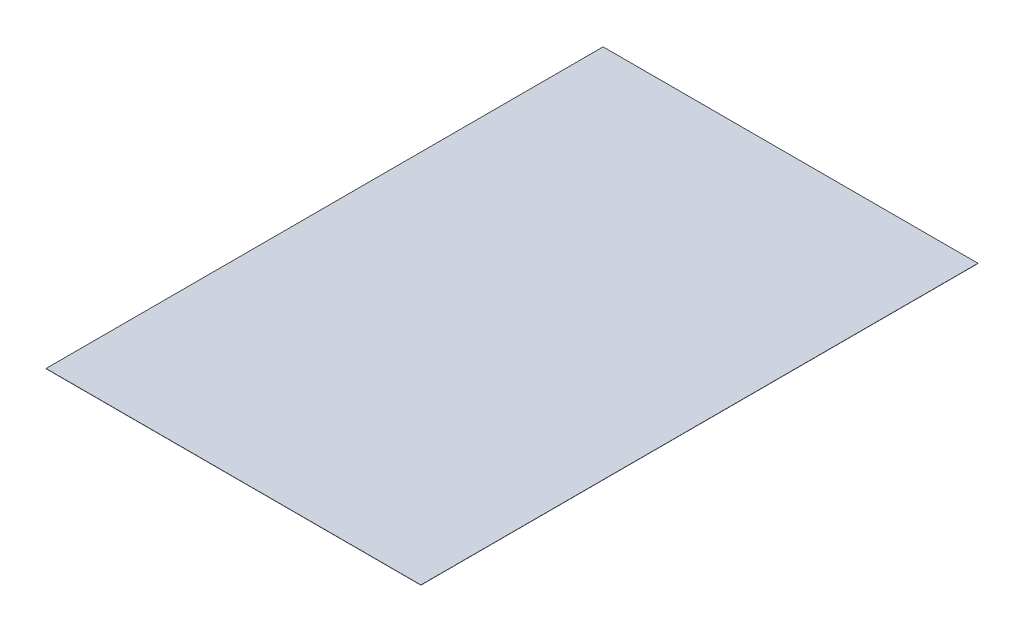
ISO-10303-21;
HEADER;
FILE_DESCRIPTION(('STEP AP214'),'2;1');
FILE_NAME('part.step','',(''),(''),'','','');
FILE_SCHEMA(('AUTOMOTIVE_DESIGN { 1 0 10303 214 1 1 1 1 }'));
ENDSEC;
DATA;
#1=APPLICATION_CONTEXT('core data for automotive mechanical design processes');
#2=APPLICATION_PROTOCOL_DEFINITION('international standard','automotive_design',2000,#1);
#3=PRODUCT_CONTEXT('',#1,'mechanical');
#4=PRODUCT('Part','Part','',(#3));
#5=PRODUCT_RELATED_PRODUCT_CATEGORY('part','',(#4));
#6=PRODUCT_DEFINITION_FORMATION('','',#4);
#7=PRODUCT_DEFINITION_CONTEXT('part definition',#1,'design');
#8=PRODUCT_DEFINITION('design','',#6,#7);
#9=PRODUCT_DEFINITION_SHAPE('','',#8);
#10=(LENGTH_UNIT() NAMED_UNIT(*) SI_UNIT(.MILLI.,.METRE.));
#11=(NAMED_UNIT(*) PLANE_ANGLE_UNIT() SI_UNIT($,.RADIAN.));
#12=(NAMED_UNIT(*) SI_UNIT($,.STERADIAN.) SOLID_ANGLE_UNIT());
#13=UNCERTAINTY_MEASURE_WITH_UNIT(LENGTH_MEASURE(1.E-05),#10,'distance_accuracy_value','');
#14=(GEOMETRIC_REPRESENTATION_CONTEXT(3) GLOBAL_UNCERTAINTY_ASSIGNED_CONTEXT((#13)) GLOBAL_UNIT_ASSIGNED_CONTEXT((#10,
#11,#12)) REPRESENTATION_CONTEXT('',''));
#15=CARTESIAN_POINT('',(0.,0.,0.));
#16=DIRECTION('',(0.,0.,1.));
#17=DIRECTION('',(1.,0.,0.));
#18=AXIS2_PLACEMENT_3D('',#15,#16,#17);
#19=CARTESIAN_POINT('',(-1043.,1.,-1550.));
#20=DIRECTION('',(1.,0.,0.));
#21=DIRECTION('',(0.,0.,-1.));
#22=AXIS2_PLACEMENT_3D('',#19,#20,#21);
#23=PLANE('',#22);
#24=DIRECTION('',(0.,0.,1.));
#25=VECTOR('',#24,1.);
#26=CARTESIAN_POINT('',(-1043.,0.,-1550.));
#27=LINE('',#26,#25);
#28=CARTESIAN_POINT('',(-1043.,0.,-1550.));
#29=VERTEX_POINT('',#28);
#30=CARTESIAN_POINT('',(-1043.,0.,1550.));
#31=VERTEX_POINT('',#30);
#32=EDGE_CURVE('E113',#29,#31,#27,.T.);
#33=ORIENTED_EDGE('',*,*,#32,.T.);
#34=DIRECTION('',(0.,-1.,0.));
#35=VECTOR('',#34,1.);
#36=CARTESIAN_POINT('',(-1043.,1.,1550.));
#37=LINE('',#36,#35);
#38=CARTESIAN_POINT('',(-1043.,1.,1550.));
#39=VERTEX_POINT('',#38);
#40=EDGE_CURVE('E11',#39,#31,#37,.T.);
#41=ORIENTED_EDGE('',*,*,#40,.F.);
#42=DIRECTION('',(0.,0.,1.));
#43=VECTOR('',#42,1.);
#44=CARTESIAN_POINT('',(-1043.,1.,-1550.));
#45=LINE('',#44,#43);
#46=CARTESIAN_POINT('',(-1043.,1.,-1550.));
#47=VERTEX_POINT('',#46);
#48=EDGE_CURVE('E97',#47,#39,#45,.T.);
#49=ORIENTED_EDGE('',*,*,#48,.F.);
#50=DIRECTION('',(0.,-1.,0.));
#51=VECTOR('',#50,1.);
#52=CARTESIAN_POINT('',(-1043.,1.,-1550.));
#53=LINE('',#52,#51);
#54=EDGE_CURVE('E109',#47,#29,#53,.T.);
#55=ORIENTED_EDGE('',*,*,#54,.T.);
#56=EDGE_LOOP('',(#33,#41,#49,#55));
#57=FACE_BOUND('',#56,.T.);
#58=ADVANCED_FACE('F45',(#57),#23,.F.);
#59=CARTESIAN_POINT('',(1043.,1.,1550.));
#60=DIRECTION('',(0.,0.,-1.));
#61=DIRECTION('',(-1.,0.,0.));
#62=AXIS2_PLACEMENT_3D('',#59,#60,#61);
#63=PLANE('',#62);
#64=DIRECTION('',(1.,0.,0.));
#65=VECTOR('',#64,1.);
#66=CARTESIAN_POINT('',(1043.,0.,1550.));
#67=LINE('',#66,#65);
#68=CARTESIAN_POINT('',(1043.,0.,1550.));
#69=VERTEX_POINT('',#68);
#70=EDGE_CURVE('E102',#31,#69,#67,.T.);
#71=ORIENTED_EDGE('',*,*,#70,.T.);
#72=DIRECTION('',(0.,-1.,0.));
#73=VECTOR('',#72,1.);
#74=CARTESIAN_POINT('',(1043.,1.,1550.));
#75=LINE('',#74,#73);
#76=CARTESIAN_POINT('',(1043.,1.,1550.));
#77=VERTEX_POINT('',#76);
#78=EDGE_CURVE('E54',#77,#69,#75,.T.);
#79=ORIENTED_EDGE('',*,*,#78,.F.);
#80=DIRECTION('',(1.,0.,0.));
#81=VECTOR('',#80,1.);
#82=CARTESIAN_POINT('',(1043.,1.,1550.));
#83=LINE('',#82,#81);
#84=EDGE_CURVE('E92',#39,#77,#83,.T.);
#85=ORIENTED_EDGE('',*,*,#84,.F.);
#86=ORIENTED_EDGE('',*,*,#40,.T.);
#87=EDGE_LOOP('',(#71,#79,#85,#86));
#88=FACE_BOUND('',#87,.T.);
#89=ADVANCED_FACE('F101',(#88),#63,.F.);
#90=CARTESIAN_POINT('',(1043.,1.,-1550.));
#91=DIRECTION('',(-1.,0.,0.));
#92=DIRECTION('',(0.,0.,1.));
#93=AXIS2_PLACEMENT_3D('',#90,#91,#92);
#94=PLANE('',#93);
#95=DIRECTION('',(0.,0.,-1.));
#96=VECTOR('',#95,1.);
#97=CARTESIAN_POINT('',(1043.,0.,-1550.));
#98=LINE('',#97,#96);
#99=CARTESIAN_POINT('',(1043.,0.,-1550.));
#100=VERTEX_POINT('',#99);
#101=EDGE_CURVE('E79',#69,#100,#98,.T.);
#102=ORIENTED_EDGE('',*,*,#101,.T.);
#103=DIRECTION('',(0.,-1.,0.));
#104=VECTOR('',#103,1.);
#105=CARTESIAN_POINT('',(1043.,1.,-1550.));
#106=LINE('',#105,#104);
#107=CARTESIAN_POINT('',(1043.,1.,-1550.));
#108=VERTEX_POINT('',#107);
#109=EDGE_CURVE('E104',#108,#100,#106,.T.);
#110=ORIENTED_EDGE('',*,*,#109,.F.);
#111=DIRECTION('',(0.,0.,-1.));
#112=VECTOR('',#111,1.);
#113=CARTESIAN_POINT('',(1043.,1.,-1550.));
#114=LINE('',#113,#112);
#115=EDGE_CURVE('E95',#77,#108,#114,.T.);
#116=ORIENTED_EDGE('',*,*,#115,.F.);
#117=ORIENTED_EDGE('',*,*,#78,.T.);
#118=EDGE_LOOP('',(#102,#110,#116,#117));
#119=FACE_BOUND('',#118,.T.);
#120=ADVANCED_FACE('F105',(#119),#94,.F.);
#121=CARTESIAN_POINT('',(1043.,1.,-1550.));
#122=DIRECTION('',(0.,0.,1.));
#123=DIRECTION('',(1.,0.,0.));
#124=AXIS2_PLACEMENT_3D('',#121,#122,#123);
#125=PLANE('',#124);
#126=DIRECTION('',(-1.,0.,0.));
#127=VECTOR('',#126,1.);
#128=CARTESIAN_POINT('',(1043.,0.,-1550.));
#129=LINE('',#128,#127);
#130=EDGE_CURVE('E85',#100,#29,#129,.T.);
#131=ORIENTED_EDGE('',*,*,#130,.T.);
#132=ORIENTED_EDGE('',*,*,#54,.F.);
#133=DIRECTION('',(-1.,0.,0.));
#134=VECTOR('',#133,1.);
#135=CARTESIAN_POINT('',(1043.,1.,-1550.));
#136=LINE('',#135,#134);
#137=EDGE_CURVE('E62',#108,#47,#136,.T.);
#138=ORIENTED_EDGE('',*,*,#137,.F.);
#139=ORIENTED_EDGE('',*,*,#109,.T.);
#140=EDGE_LOOP('',(#131,#132,#138,#139));
#141=FACE_BOUND('',#140,.T.);
#142=ADVANCED_FACE('F126',(#141),#125,.F.);
#143=CARTESIAN_POINT('',(0.,1.,0.));
#144=DIRECTION('',(0.,-1.,0.));
#145=DIRECTION('',(0.,0.,-1.));
#146=AXIS2_PLACEMENT_3D('',#143,#144,#145);
#147=PLANE('',#146);
#148=ORIENTED_EDGE('',*,*,#48,.T.);
#149=ORIENTED_EDGE('',*,*,#84,.T.);
#150=ORIENTED_EDGE('',*,*,#115,.T.);
#151=ORIENTED_EDGE('',*,*,#137,.T.);
#152=EDGE_LOOP('',(#148,#149,#150,#151));
#153=FACE_BOUND('',#152,.T.);
#154=ADVANCED_FACE('F93',(#153),#147,.F.);
#155=CARTESIAN_POINT('',(0.,0.,0.));
#156=DIRECTION('',(0.,-1.,0.));
#157=DIRECTION('',(0.,0.,-1.));
#158=AXIS2_PLACEMENT_3D('',#155,#156,#157);
#159=PLANE('',#158);
#160=ORIENTED_EDGE('',*,*,#32,.F.);
#161=ORIENTED_EDGE('',*,*,#130,.F.);
#162=ORIENTED_EDGE('',*,*,#101,.F.);
#163=ORIENTED_EDGE('',*,*,#70,.F.);
#164=EDGE_LOOP('',(#160,#161,#162,#163));
#165=FACE_BOUND('',#164,.T.);
#166=ADVANCED_FACE('F129',(#165),#159,.T.);
#167=CLOSED_SHELL('',(#58,#89,#120,#142,#154,#166));
#168=MANIFOLD_SOLID_BREP('B2',#167);
#169=ADVANCED_BREP_SHAPE_REPRESENTATION('',(#18,#168),#14);
#170=SHAPE_DEFINITION_REPRESENTATION(#9,#169);
ENDSEC;
END-ISO-10303-21;
